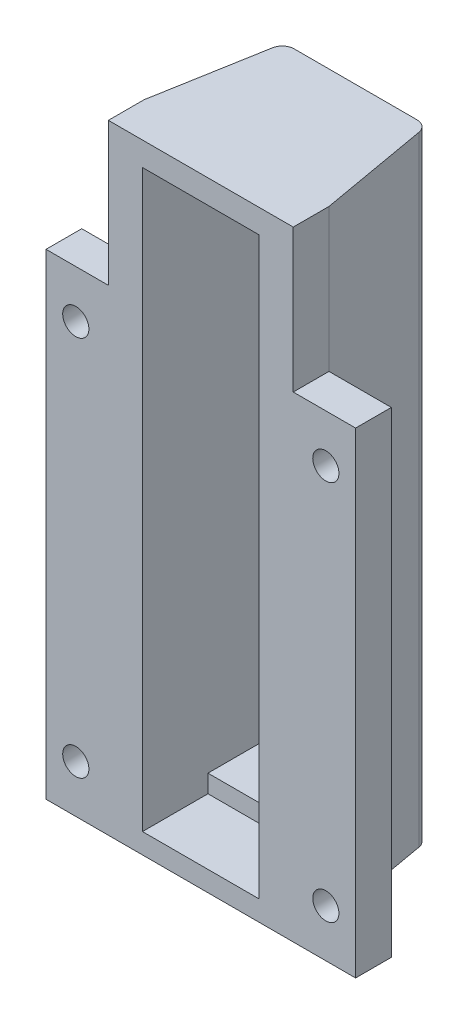
ISO-10303-21;
HEADER;
FILE_DESCRIPTION(('STEP AP214'),'2;1');
FILE_NAME('part.step','',(''),(''),'','','');
FILE_SCHEMA(('AUTOMOTIVE_DESIGN { 1 0 10303 214 1 1 1 1 }'));
ENDSEC;
DATA;
#1=APPLICATION_CONTEXT('core data for automotive mechanical design processes');
#2=APPLICATION_PROTOCOL_DEFINITION('international standard','automotive_design',2000,#1);
#3=PRODUCT_CONTEXT('',#1,'mechanical');
#4=PRODUCT('Part','Part','',(#3));
#5=PRODUCT_RELATED_PRODUCT_CATEGORY('part','',(#4));
#6=PRODUCT_DEFINITION_FORMATION('','',#4);
#7=PRODUCT_DEFINITION_CONTEXT('part definition',#1,'design');
#8=PRODUCT_DEFINITION('design','',#6,#7);
#9=PRODUCT_DEFINITION_SHAPE('','',#8);
#10=(LENGTH_UNIT() NAMED_UNIT(*) SI_UNIT(.MILLI.,.METRE.));
#11=(NAMED_UNIT(*) PLANE_ANGLE_UNIT() SI_UNIT($,.RADIAN.));
#12=(NAMED_UNIT(*) SI_UNIT($,.STERADIAN.) SOLID_ANGLE_UNIT());
#13=UNCERTAINTY_MEASURE_WITH_UNIT(LENGTH_MEASURE(1.E-05),#10,'distance_accuracy_value','');
#14=(GEOMETRIC_REPRESENTATION_CONTEXT(3) GLOBAL_UNCERTAINTY_ASSIGNED_CONTEXT((#13)) GLOBAL_UNIT_ASSIGNED_CONTEXT((#10,
#11,#12)) REPRESENTATION_CONTEXT('',''));
#15=CARTESIAN_POINT('',(0.,0.,0.));
#16=DIRECTION('',(0.,0.,1.));
#17=DIRECTION('',(1.,0.,0.));
#18=AXIS2_PLACEMENT_3D('',#15,#16,#17);
#19=CARTESIAN_POINT('',(0.,5.34999999999999,-11.5));
#20=DIRECTION('',(0.,0.,1.));
#21=DIRECTION('',(1.,0.,0.));
#22=AXIS2_PLACEMENT_3D('',#19,#20,#21);
#23=CYLINDRICAL_SURFACE('',#22,1.1);
#24=CARTESIAN_POINT('',(0.,5.34999999999999,-8.5));
#25=DIRECTION('',(0.,0.,1.));
#26=DIRECTION('',(-1.,0.,0.));
#27=AXIS2_PLACEMENT_3D('',#24,#25,#26);
#28=CIRCLE('',#27,1.1);
#29=CARTESIAN_POINT('',(-1.1,5.34999999999999,-8.5));
#30=VERTEX_POINT('',#29);
#31=EDGE_CURVE('E242',#30,#30,#28,.T.);
#32=ORIENTED_EDGE('',*,*,#31,.T.);
#33=EDGE_LOOP('',(#32));
#34=FACE_BOUND('',#33,.T.);
#35=CARTESIAN_POINT('',(0.,5.34999999999999,-10.3));
#36=DIRECTION('',(0.,0.,-1.));
#37=DIRECTION('',(-1.,0.,0.));
#38=AXIS2_PLACEMENT_3D('',#35,#36,#37);
#39=CIRCLE('',#38,1.1);
#40=CARTESIAN_POINT('',(-1.1,5.34999999999999,-10.3));
#41=VERTEX_POINT('',#40);
#42=EDGE_CURVE('E430',#41,#41,#39,.F.);
#43=ORIENTED_EDGE('',*,*,#42,.F.);
#44=EDGE_LOOP('',(#43));
#45=FACE_BOUND('',#44,.T.);
#46=ADVANCED_FACE('F41',(#34,#45),#23,.F.);
#47=CARTESIAN_POINT('',(0.,46.35,-11.5));
#48=DIRECTION('',(0.,0.,1.));
#49=DIRECTION('',(1.,0.,0.));
#50=AXIS2_PLACEMENT_3D('',#47,#48,#49);
#51=CYLINDRICAL_SURFACE('',#50,1.1);
#52=CARTESIAN_POINT('',(0.,46.35,-8.5));
#53=DIRECTION('',(0.,0.,1.));
#54=DIRECTION('',(1.,0.,0.));
#55=AXIS2_PLACEMENT_3D('',#52,#53,#54);
#56=CIRCLE('',#55,1.1);
#57=CARTESIAN_POINT('',(1.1,46.35,-8.5));
#58=VERTEX_POINT('',#57);
#59=EDGE_CURVE('E249',#58,#58,#56,.T.);
#60=ORIENTED_EDGE('',*,*,#59,.T.);
#61=EDGE_LOOP('',(#60));
#62=FACE_BOUND('',#61,.T.);
#63=CARTESIAN_POINT('',(0.,46.35,-10.3));
#64=DIRECTION('',(0.,0.,-1.));
#65=DIRECTION('',(-1.,0.,0.));
#66=AXIS2_PLACEMENT_3D('',#63,#64,#65);
#67=CIRCLE('',#66,1.1);
#68=CARTESIAN_POINT('',(-1.1,46.35,-10.3));
#69=VERTEX_POINT('',#68);
#70=EDGE_CURVE('E427',#69,#69,#67,.F.);
#71=ORIENTED_EDGE('',*,*,#70,.F.);
#72=EDGE_LOOP('',(#71));
#73=FACE_BOUND('',#72,.T.);
#74=ADVANCED_FACE('F493',(#62,#73),#51,.F.);
#75=CARTESIAN_POINT('',(0.,40.,-8.5));
#76=DIRECTION('',(0.,0.,-1.));
#77=DIRECTION('',(-1.,0.,0.));
#78=AXIS2_PLACEMENT_3D('',#75,#76,#77);
#79=PLANE('',#78);
#80=ORIENTED_EDGE('',*,*,#59,.F.);
#81=EDGE_LOOP('',(#80));
#82=FACE_BOUND('',#81,.T.);
#83=ORIENTED_EDGE('',*,*,#31,.F.);
#84=EDGE_LOOP('',(#83));
#85=FACE_BOUND('',#84,.T.);
#86=DIRECTION('',(0.,1.,0.));
#87=VECTOR('',#86,1.);
#88=CARTESIAN_POINT('',(4.89999999999999,3.2,-8.49999999999999));
#89=LINE('',#88,#87);
#90=CARTESIAN_POINT('',(4.89999999999999,3.2,-8.49999999999999));
#91=VERTEX_POINT('',#90);
#92=CARTESIAN_POINT('',(4.89999999999999,48.5,-8.49999999999999));
#93=VERTEX_POINT('',#92);
#94=EDGE_CURVE('E322',#91,#93,#89,.T.);
#95=ORIENTED_EDGE('',*,*,#94,.T.);
#96=DIRECTION('',(-1.,0.,0.));
#97=VECTOR('',#96,1.);
#98=CARTESIAN_POINT('',(-4.90000000000001,48.5,-8.49999999999999));
#99=LINE('',#98,#97);
#100=CARTESIAN_POINT('',(-4.90000000000001,48.5,-8.49999999999999));
#101=VERTEX_POINT('',#100);
#102=EDGE_CURVE('E317',#93,#101,#99,.T.);
#103=ORIENTED_EDGE('',*,*,#102,.T.);
#104=DIRECTION('',(0.,-1.,0.));
#105=VECTOR('',#104,1.);
#106=CARTESIAN_POINT('',(-4.90000000000001,3.2,-8.49999999999999));
#107=LINE('',#106,#105);
#108=CARTESIAN_POINT('',(-4.90000000000001,3.2,-8.49999999999999));
#109=VERTEX_POINT('',#108);
#110=EDGE_CURVE('E331',#101,#109,#107,.T.);
#111=ORIENTED_EDGE('',*,*,#110,.T.);
#112=DIRECTION('',(1.,0.,0.));
#113=VECTOR('',#112,1.);
#114=CARTESIAN_POINT('',(-4.90000000000001,3.2,-8.49999999999999));
#115=LINE('',#114,#113);
#116=EDGE_CURVE('E327',#109,#91,#115,.T.);
#117=ORIENTED_EDGE('',*,*,#116,.T.);
#118=EDGE_LOOP('',(#95,#103,#111,#117));
#119=FACE_BOUND('',#118,.T.);
#120=DIRECTION('',(0.,1.,0.));
#121=VECTOR('',#120,1.);
#122=CARTESIAN_POINT('',(1.75,8.35,-8.5));
#123=LINE('',#122,#121);
#124=CARTESIAN_POINT('',(1.75,8.35,-8.5));
#125=VERTEX_POINT('',#124);
#126=CARTESIAN_POINT('',(1.75,43.35,-8.5));
#127=VERTEX_POINT('',#126);
#128=EDGE_CURVE('E218',#125,#127,#123,.T.);
#129=ORIENTED_EDGE('',*,*,#128,.F.);
#130=DIRECTION('',(1.,0.,0.));
#131=VECTOR('',#130,1.);
#132=CARTESIAN_POINT('',(-1.75,8.35,-8.5));
#133=LINE('',#132,#131);
#134=CARTESIAN_POINT('',(-1.75,8.35,-8.5));
#135=VERTEX_POINT('',#134);
#136=EDGE_CURVE('E236',#135,#125,#133,.T.);
#137=ORIENTED_EDGE('',*,*,#136,.F.);
#138=DIRECTION('',(0.,-1.,0.));
#139=VECTOR('',#138,1.);
#140=CARTESIAN_POINT('',(-1.75,8.35,-8.5));
#141=LINE('',#140,#139);
#142=CARTESIAN_POINT('',(-1.75,43.35,-8.5));
#143=VERTEX_POINT('',#142);
#144=EDGE_CURVE('E239',#143,#135,#141,.T.);
#145=ORIENTED_EDGE('',*,*,#144,.F.);
#146=DIRECTION('',(-1.,0.,0.));
#147=VECTOR('',#146,1.);
#148=CARTESIAN_POINT('',(-1.75,43.35,-8.5));
#149=LINE('',#148,#147);
#150=EDGE_CURVE('E248',#127,#143,#149,.T.);
#151=ORIENTED_EDGE('',*,*,#150,.F.);
#152=EDGE_LOOP('',(#129,#137,#145,#151));
#153=FACE_BOUND('',#152,.T.);
#154=ADVANCED_FACE('F499',(#82,#85,#119,#153),#79,.F.);
#155=CARTESIAN_POINT('',(0.,40.,0.));
#156=DIRECTION('',(0.,1.,0.));
#157=DIRECTION('',(0.,0.,1.));
#158=AXIS2_PLACEMENT_3D('',#155,#156,#157);
#159=PLANE('',#158);
#160=DIRECTION('',(0.,0.,-1.));
#161=VECTOR('',#160,1.);
#162=CARTESIAN_POINT('',(7.76326980708461,40.,1.5));
#163=LINE('',#162,#161);
#164=CARTESIAN_POINT('',(7.76326980708461,40.,1.5));
#165=VERTEX_POINT('',#164);
#166=CARTESIAN_POINT('',(7.76326980708461,40.,-1.5));
#167=VERTEX_POINT('',#166);
#168=EDGE_CURVE('E346',#165,#167,#163,.T.);
#169=ORIENTED_EDGE('',*,*,#168,.F.);
#170=DIRECTION('',(1.,0.,0.));
#171=VECTOR('',#170,1.);
#172=CARTESIAN_POINT('',(0.,40.,1.5));
#173=LINE('',#172,#171);
#174=CARTESIAN_POINT('',(13.,40.,1.5));
#175=VERTEX_POINT('',#174);
#176=EDGE_CURVE('E380',#165,#175,#173,.T.);
#177=ORIENTED_EDGE('',*,*,#176,.T.);
#178=DIRECTION('',(0.,0.,-1.));
#179=VECTOR('',#178,1.);
#180=CARTESIAN_POINT('',(13.,40.,0.));
#181=LINE('',#180,#179);
#182=CARTESIAN_POINT('',(13.,40.,-1.5));
#183=VERTEX_POINT('',#182);
#184=EDGE_CURVE('E383',#175,#183,#181,.T.);
#185=ORIENTED_EDGE('',*,*,#184,.T.);
#186=DIRECTION('',(1.,0.,0.));
#187=VECTOR('',#186,1.);
#188=CARTESIAN_POINT('',(0.,40.,-1.5));
#189=LINE('',#188,#187);
#190=EDGE_CURVE('E385',#167,#183,#189,.T.);
#191=ORIENTED_EDGE('',*,*,#190,.F.);
#192=EDGE_LOOP('',(#169,#177,#185,#191));
#193=FACE_BOUND('',#192,.T.);
#194=ADVANCED_FACE('F566',(#193),#159,.T.);
#195=CARTESIAN_POINT('',(0.,40.,-11.5));
#196=DIRECTION('',(0.,0.,-1.));
#197=DIRECTION('',(-1.,0.,0.));
#198=AXIS2_PLACEMENT_3D('',#195,#196,#197);
#199=PLANE('',#198);
#200=CARTESIAN_POINT('',(0.,46.35,-11.5));
#201=DIRECTION('',(0.,0.,-1.));
#202=DIRECTION('',(-1.,0.,0.));
#203=AXIS2_PLACEMENT_3D('',#200,#201,#202);
#204=CIRCLE('',#203,1.95);
#205=CARTESIAN_POINT('',(-1.95,46.35,-11.5));
#206=VERTEX_POINT('',#205);
#207=EDGE_CURVE('E610',#206,#206,#204,.T.);
#208=ORIENTED_EDGE('',*,*,#207,.F.);
#209=EDGE_LOOP('',(#208));
#210=FACE_BOUND('',#209,.T.);
#211=CARTESIAN_POINT('',(0.,5.34999999999999,-11.5));
#212=DIRECTION('',(0.,0.,-1.));
#213=DIRECTION('',(-1.,0.,0.));
#214=AXIS2_PLACEMENT_3D('',#211,#212,#213);
#215=CIRCLE('',#214,1.95);
#216=CARTESIAN_POINT('',(-1.95,5.34999999999999,-11.5));
#217=VERTEX_POINT('',#216);
#218=EDGE_CURVE('E613',#217,#217,#215,.T.);
#219=ORIENTED_EDGE('',*,*,#218,.F.);
#220=EDGE_LOOP('',(#219));
#221=FACE_BOUND('',#220,.T.);
#222=DIRECTION('',(0.,1.,0.));
#223=VECTOR('',#222,1.);
#224=CARTESIAN_POINT('',(1.75,8.35,-11.5));
#225=LINE('',#224,#223);
#226=CARTESIAN_POINT('',(1.75,8.35,-11.5));
#227=VERTEX_POINT('',#226);
#228=CARTESIAN_POINT('',(1.75,43.35,-11.5));
#229=VERTEX_POINT('',#228);
#230=EDGE_CURVE('E215',#227,#229,#225,.T.);
#231=ORIENTED_EDGE('',*,*,#230,.T.);
#232=DIRECTION('',(-1.,0.,0.));
#233=VECTOR('',#232,1.);
#234=CARTESIAN_POINT('',(-1.75,43.35,-11.5));
#235=LINE('',#234,#233);
#236=CARTESIAN_POINT('',(-1.75,43.35,-11.5));
#237=VERTEX_POINT('',#236);
#238=EDGE_CURVE('E227',#229,#237,#235,.T.);
#239=ORIENTED_EDGE('',*,*,#238,.T.);
#240=DIRECTION('',(0.,-1.,0.));
#241=VECTOR('',#240,1.);
#242=CARTESIAN_POINT('',(-1.75,8.35,-11.5));
#243=LINE('',#242,#241);
#244=CARTESIAN_POINT('',(-1.75,8.35,-11.5));
#245=VERTEX_POINT('',#244);
#246=EDGE_CURVE('E231',#237,#245,#243,.T.);
#247=ORIENTED_EDGE('',*,*,#246,.T.);
#248=DIRECTION('',(1.,0.,0.));
#249=VECTOR('',#248,1.);
#250=CARTESIAN_POINT('',(-1.75,8.35,-11.5));
#251=LINE('',#250,#249);
#252=EDGE_CURVE('E223',#245,#227,#251,.T.);
#253=ORIENTED_EDGE('',*,*,#252,.T.);
#254=EDGE_LOOP('',(#231,#239,#247,#253));
#255=FACE_BOUND('',#254,.T.);
#256=DIRECTION('',(-1.,0.,0.));
#257=VECTOR('',#256,1.);
#258=CARTESIAN_POINT('',(-6.,52.,-11.5));
#259=LINE('',#258,#257);
#260=CARTESIAN_POINT('',(5.16090036882272,52.,-11.5));
#261=VERTEX_POINT('',#260);
#262=CARTESIAN_POINT('',(-5.16090036882272,52.,-11.5));
#263=VERTEX_POINT('',#262);
#264=EDGE_CURVE('E343',#261,#263,#259,.T.);
#265=ORIENTED_EDGE('',*,*,#264,.F.);
#266=DIRECTION('',(0.,-1.,0.));
#267=VECTOR('',#266,1.);
#268=CARTESIAN_POINT('',(5.16090036882272,40.,-11.5));
#269=LINE('',#268,#267);
#270=CARTESIAN_POINT('',(5.16090036882272,0.,-11.5));
#271=VERTEX_POINT('',#270);
#272=EDGE_CURVE('E435',#261,#271,#269,.T.);
#273=ORIENTED_EDGE('',*,*,#272,.T.);
#274=DIRECTION('',(1.,0.,0.));
#275=VECTOR('',#274,1.);
#276=CARTESIAN_POINT('',(0.,0.,-11.5));
#277=LINE('',#276,#275);
#278=CARTESIAN_POINT('',(-5.16090036882272,0.,-11.5));
#279=VERTEX_POINT('',#278);
#280=EDGE_CURVE('E372',#279,#271,#277,.T.);
#281=ORIENTED_EDGE('',*,*,#280,.F.);
#282=DIRECTION('',(0.,-1.,0.));
#283=VECTOR('',#282,1.);
#284=CARTESIAN_POINT('',(-5.16090036882272,52.,-11.5));
#285=LINE('',#284,#283);
#286=EDGE_CURVE('E422',#279,#263,#285,.F.);
#287=ORIENTED_EDGE('',*,*,#286,.T.);
#288=EDGE_LOOP('',(#265,#273,#281,#287));
#289=FACE_BOUND('',#288,.T.);
#290=ADVANCED_FACE('F233',(#210,#221,#255,#289),#199,.T.);
#291=CARTESIAN_POINT('',(-7.78569368648029,40.,-1.372827860458));
#292=DIRECTION('',(0.984807753012209,0.,0.173648177666927));
#293=DIRECTION('',(0.173648177666927,0.,-0.984807753012209));
#294=AXIS2_PLACEMENT_3D('',#291,#292,#293);
#295=PLANE('',#294);
#296=DIRECTION('',(-0.173648177666927,0.,0.984807753012209));
#297=VECTOR('',#296,1.);
#298=CARTESIAN_POINT('',(-6.,52.,-11.5));
#299=LINE('',#298,#297);
#300=CARTESIAN_POINT('',(-6.14570812183493,52.,-10.6736481776669));
#301=VERTEX_POINT('',#300);
#302=CARTESIAN_POINT('',(-7.76326980708461,52.,-1.5));
#303=VERTEX_POINT('',#302);
#304=EDGE_CURVE('E345',#301,#303,#299,.T.);
#305=ORIENTED_EDGE('',*,*,#304,.F.);
#306=DIRECTION('',(0.,-1.,0.));
#307=VECTOR('',#306,1.);
#308=CARTESIAN_POINT('',(-6.14570812183492,0.,-10.6736481776669));
#309=LINE('',#308,#307);
#310=CARTESIAN_POINT('',(-6.14570812183492,0.,-10.6736481776669));
#311=VERTEX_POINT('',#310);
#312=EDGE_CURVE('E13',#301,#311,#309,.T.);
#313=ORIENTED_EDGE('',*,*,#312,.T.);
#314=DIRECTION('',(-0.173648177666927,0.,0.984807753012209));
#315=VECTOR('',#314,1.);
#316=CARTESIAN_POINT('',(-7.78569368648029,0.,-1.372827860458));
#317=LINE('',#316,#315);
#318=CARTESIAN_POINT('',(-7.76326980708461,0.,-1.5));
#319=VERTEX_POINT('',#318);
#320=EDGE_CURVE('E391',#311,#319,#317,.T.);
#321=ORIENTED_EDGE('',*,*,#320,.T.);
#322=DIRECTION('',(0.,-1.,0.));
#323=VECTOR('',#322,1.);
#324=CARTESIAN_POINT('',(-7.76326980708461,40.,-1.5));
#325=LINE('',#324,#323);
#326=CARTESIAN_POINT('',(-7.76326980708461,40.,-1.5));
#327=VERTEX_POINT('',#326);
#328=EDGE_CURVE('E419',#327,#319,#325,.T.);
#329=ORIENTED_EDGE('',*,*,#328,.F.);
#330=DIRECTION('',(0.,-1.,0.));
#331=VECTOR('',#330,1.);
#332=CARTESIAN_POINT('',(-7.76326980708461,52.,-1.5));
#333=LINE('',#332,#331);
#334=EDGE_CURVE('E369',#303,#327,#333,.T.);
#335=ORIENTED_EDGE('',*,*,#334,.F.);
#336=EDGE_LOOP('',(#305,#313,#321,#329,#335));
#337=FACE_BOUND('',#336,.T.);
#338=ADVANCED_FACE('F483',(#337),#295,.F.);
#339=CARTESIAN_POINT('',(0.,40.,-1.5));
#340=DIRECTION('',(0.,0.,-1.));
#341=DIRECTION('',(-1.,0.,0.));
#342=AXIS2_PLACEMENT_3D('',#339,#340,#341);
#343=PLANE('',#342);
#344=CARTESIAN_POINT('',(-10.5,4.,-1.5));
#345=DIRECTION('',(0.,0.,-1.));
#346=DIRECTION('',(-1.,0.,0.));
#347=AXIS2_PLACEMENT_3D('',#344,#345,#346);
#348=CIRCLE('',#347,1.1);
#349=CARTESIAN_POINT('',(-11.6,4.,-1.5));
#350=VERTEX_POINT('',#349);
#351=EDGE_CURVE('E274',#350,#350,#348,.T.);
#352=ORIENTED_EDGE('',*,*,#351,.F.);
#353=EDGE_LOOP('',(#352));
#354=FACE_BOUND('',#353,.T.);
#355=CARTESIAN_POINT('',(-10.5,36.,-1.5));
#356=DIRECTION('',(0.,0.,-1.));
#357=DIRECTION('',(-1.,0.,0.));
#358=AXIS2_PLACEMENT_3D('',#355,#356,#357);
#359=CIRCLE('',#358,1.1);
#360=CARTESIAN_POINT('',(-11.6,36.,-1.5));
#361=VERTEX_POINT('',#360);
#362=EDGE_CURVE('E271',#361,#361,#359,.T.);
#363=ORIENTED_EDGE('',*,*,#362,.F.);
#364=EDGE_LOOP('',(#363));
#365=FACE_BOUND('',#364,.T.);
#366=DIRECTION('',(1.,0.,0.));
#367=VECTOR('',#366,1.);
#368=CARTESIAN_POINT('',(0.,0.,-1.5));
#369=LINE('',#368,#367);
#370=CARTESIAN_POINT('',(-13.,0.,-1.5));
#371=VERTEX_POINT('',#370);
#372=EDGE_CURVE('E393',#371,#319,#369,.T.);
#373=ORIENTED_EDGE('',*,*,#372,.F.);
#374=DIRECTION('',(0.,-1.,0.));
#375=VECTOR('',#374,1.);
#376=CARTESIAN_POINT('',(-13.,40.,-1.5));
#377=LINE('',#376,#375);
#378=CARTESIAN_POINT('',(-13.,40.,-1.5));
#379=VERTEX_POINT('',#378);
#380=EDGE_CURVE('E417',#379,#371,#377,.T.);
#381=ORIENTED_EDGE('',*,*,#380,.F.);
#382=DIRECTION('',(1.,0.,0.));
#383=VECTOR('',#382,1.);
#384=CARTESIAN_POINT('',(0.,40.,-1.5));
#385=LINE('',#384,#383);
#386=EDGE_CURVE('E373',#379,#327,#385,.T.);
#387=ORIENTED_EDGE('',*,*,#386,.T.);
#388=ORIENTED_EDGE('',*,*,#328,.T.);
#389=EDGE_LOOP('',(#373,#381,#387,#388));
#390=FACE_BOUND('',#389,.T.);
#391=ADVANCED_FACE('F478',(#354,#365,#390),#343,.T.);
#392=CARTESIAN_POINT('',(-13.,40.,0.));
#393=DIRECTION('',(-1.,0.,0.));
#394=DIRECTION('',(0.,0.,1.));
#395=AXIS2_PLACEMENT_3D('',#392,#393,#394);
#396=PLANE('',#395);
#397=DIRECTION('',(0.,0.,-1.));
#398=VECTOR('',#397,1.);
#399=CARTESIAN_POINT('',(-13.,0.,0.));
#400=LINE('',#399,#398);
#401=CARTESIAN_POINT('',(-13.,0.,1.5));
#402=VERTEX_POINT('',#401);
#403=EDGE_CURVE('E396',#402,#371,#400,.T.);
#404=ORIENTED_EDGE('',*,*,#403,.F.);
#405=DIRECTION('',(0.,-1.,0.));
#406=VECTOR('',#405,1.);
#407=CARTESIAN_POINT('',(-13.,40.,1.5));
#408=LINE('',#407,#406);
#409=CARTESIAN_POINT('',(-13.,40.,1.5));
#410=VERTEX_POINT('',#409);
#411=EDGE_CURVE('E415',#410,#402,#408,.T.);
#412=ORIENTED_EDGE('',*,*,#411,.F.);
#413=DIRECTION('',(0.,0.,-1.));
#414=VECTOR('',#413,1.);
#415=CARTESIAN_POINT('',(-13.,40.,0.));
#416=LINE('',#415,#414);
#417=EDGE_CURVE('E376',#410,#379,#416,.T.);
#418=ORIENTED_EDGE('',*,*,#417,.T.);
#419=ORIENTED_EDGE('',*,*,#380,.T.);
#420=EDGE_LOOP('',(#404,#412,#418,#419));
#421=FACE_BOUND('',#420,.T.);
#422=ADVANCED_FACE('F474',(#421),#396,.T.);
#423=CARTESIAN_POINT('',(0.,40.,1.5));
#424=DIRECTION('',(0.,0.,-1.));
#425=DIRECTION('',(-1.,0.,0.));
#426=AXIS2_PLACEMENT_3D('',#423,#424,#425);
#427=PLANE('',#426);
#428=CARTESIAN_POINT('',(10.5,36.,1.5));
#429=DIRECTION('',(0.,0.,1.));
#430=DIRECTION('',(-1.,0.,0.));
#431=AXIS2_PLACEMENT_3D('',#428,#429,#430);
#432=CIRCLE('',#431,1.1);
#433=CARTESIAN_POINT('',(9.4,36.,1.5));
#434=VERTEX_POINT('',#433);
#435=EDGE_CURVE('E254',#434,#434,#432,.T.);
#436=ORIENTED_EDGE('',*,*,#435,.F.);
#437=EDGE_LOOP('',(#436));
#438=FACE_BOUND('',#437,.T.);
#439=CARTESIAN_POINT('',(10.5,4.,1.5));
#440=DIRECTION('',(0.,0.,1.));
#441=DIRECTION('',(1.,0.,0.));
#442=AXIS2_PLACEMENT_3D('',#439,#440,#441);
#443=CIRCLE('',#442,1.1);
#444=CARTESIAN_POINT('',(11.6,4.,1.5));
#445=VERTEX_POINT('',#444);
#446=EDGE_CURVE('E263',#445,#445,#443,.T.);
#447=ORIENTED_EDGE('',*,*,#446,.F.);
#448=EDGE_LOOP('',(#447));
#449=FACE_BOUND('',#448,.T.);
#450=CARTESIAN_POINT('',(-10.5,4.,1.5));
#451=DIRECTION('',(0.,0.,1.));
#452=DIRECTION('',(-1.,0.,0.));
#453=AXIS2_PLACEMENT_3D('',#450,#451,#452);
#454=CIRCLE('',#453,1.1);
#455=CARTESIAN_POINT('',(-11.6,4.,1.5));
#456=VERTEX_POINT('',#455);
#457=EDGE_CURVE('E259',#456,#456,#454,.T.);
#458=ORIENTED_EDGE('',*,*,#457,.F.);
#459=EDGE_LOOP('',(#458));
#460=FACE_BOUND('',#459,.T.);
#461=CARTESIAN_POINT('',(-10.5,36.,1.5));
#462=DIRECTION('',(0.,0.,1.));
#463=DIRECTION('',(1.,0.,0.));
#464=AXIS2_PLACEMENT_3D('',#461,#462,#463);
#465=CIRCLE('',#464,1.1);
#466=CARTESIAN_POINT('',(-9.4,36.,1.5));
#467=VERTEX_POINT('',#466);
#468=EDGE_CURVE('E262',#467,#467,#465,.T.);
#469=ORIENTED_EDGE('',*,*,#468,.F.);
#470=EDGE_LOOP('',(#469));
#471=FACE_BOUND('',#470,.T.);
#472=DIRECTION('',(0.,-1.,0.));
#473=VECTOR('',#472,1.);
#474=CARTESIAN_POINT('',(-4.90000000000001,3.2,1.5));
#475=LINE('',#474,#473);
#476=CARTESIAN_POINT('',(-4.90000000000001,50.,1.5));
#477=VERTEX_POINT('',#476);
#478=CARTESIAN_POINT('',(-4.90000000000001,1.70000000000001,1.5));
#479=VERTEX_POINT('',#478);
#480=EDGE_CURVE('E315',#477,#479,#475,.T.);
#481=ORIENTED_EDGE('',*,*,#480,.F.);
#482=DIRECTION('',(-1.,0.,0.));
#483=VECTOR('',#482,1.);
#484=CARTESIAN_POINT('',(-4.90000000000001,50.,1.5));
#485=LINE('',#484,#483);
#486=CARTESIAN_POINT('',(4.90000000000001,50.,1.5));
#487=VERTEX_POINT('',#486);
#488=EDGE_CURVE('E278',#487,#477,#485,.T.);
#489=ORIENTED_EDGE('',*,*,#488,.F.);
#490=DIRECTION('',(0.,1.,0.));
#491=VECTOR('',#490,1.);
#492=CARTESIAN_POINT('',(4.89999999999999,3.2,1.5));
#493=LINE('',#492,#491);
#494=CARTESIAN_POINT('',(4.90000000000001,1.70000000000001,1.5));
#495=VERTEX_POINT('',#494);
#496=EDGE_CURVE('E314',#495,#487,#493,.T.);
#497=ORIENTED_EDGE('',*,*,#496,.F.);
#498=DIRECTION('',(1.,0.,0.));
#499=VECTOR('',#498,1.);
#500=CARTESIAN_POINT('',(-4.90000000000001,1.70000000000001,1.5));
#501=LINE('',#500,#499);
#502=EDGE_CURVE('E279',#479,#495,#501,.T.);
#503=ORIENTED_EDGE('',*,*,#502,.F.);
#504=EDGE_LOOP('',(#481,#489,#497,#503));
#505=FACE_BOUND('',#504,.T.);
#506=DIRECTION('',(1.,0.,0.));
#507=VECTOR('',#506,1.);
#508=CARTESIAN_POINT('',(0.,0.,1.5));
#509=LINE('',#508,#507);
#510=CARTESIAN_POINT('',(13.,0.,1.5));
#511=VERTEX_POINT('',#510);
#512=EDGE_CURVE('E399',#402,#511,#509,.T.);
#513=ORIENTED_EDGE('',*,*,#512,.T.);
#514=DIRECTION('',(0.,-1.,0.));
#515=VECTOR('',#514,1.);
#516=CARTESIAN_POINT('',(13.,40.,1.5));
#517=LINE('',#516,#515);
#518=EDGE_CURVE('E412',#175,#511,#517,.T.);
#519=ORIENTED_EDGE('',*,*,#518,.F.);
#520=ORIENTED_EDGE('',*,*,#176,.F.);
#521=DIRECTION('',(0.,-1.,0.));
#522=VECTOR('',#521,1.);
#523=CARTESIAN_POINT('',(7.76326980708461,52.,1.5));
#524=LINE('',#523,#522);
#525=CARTESIAN_POINT('',(7.76326980708461,52.,1.5));
#526=VERTEX_POINT('',#525);
#527=EDGE_CURVE('E363',#526,#165,#524,.T.);
#528=ORIENTED_EDGE('',*,*,#527,.F.);
#529=DIRECTION('',(1.,0.,0.));
#530=VECTOR('',#529,1.);
#531=CARTESIAN_POINT('',(-7.76326980708461,52.,1.5));
#532=LINE('',#531,#530);
#533=CARTESIAN_POINT('',(-7.76326980708461,52.,1.5));
#534=VERTEX_POINT('',#533);
#535=EDGE_CURVE('E350',#534,#526,#532,.T.);
#536=ORIENTED_EDGE('',*,*,#535,.F.);
#537=DIRECTION('',(0.,-1.,0.));
#538=VECTOR('',#537,1.);
#539=CARTESIAN_POINT('',(-7.76326980708461,52.,1.5));
#540=LINE('',#539,#538);
#541=CARTESIAN_POINT('',(-7.76326980708461,40.,1.5));
#542=VERTEX_POINT('',#541);
#543=EDGE_CURVE('E366',#534,#542,#540,.T.);
#544=ORIENTED_EDGE('',*,*,#543,.T.);
#545=EDGE_CURVE('E381',#410,#542,#173,.T.);
#546=ORIENTED_EDGE('',*,*,#545,.F.);
#547=ORIENTED_EDGE('',*,*,#411,.T.);
#548=EDGE_LOOP('',(#513,#519,#520,#528,#536,#544,#546,#547));
#549=FACE_BOUND('',#548,.T.);
#550=ADVANCED_FACE('F469',(#438,#449,#460,#471,#505,#549),#427,.F.);
#551=CARTESIAN_POINT('',(13.,40.,0.));
#552=DIRECTION('',(-1.,0.,0.));
#553=DIRECTION('',(0.,0.,1.));
#554=AXIS2_PLACEMENT_3D('',#551,#552,#553);
#555=PLANE('',#554);
#556=DIRECTION('',(0.,0.,-1.));
#557=VECTOR('',#556,1.);
#558=CARTESIAN_POINT('',(13.,0.,0.));
#559=LINE('',#558,#557);
#560=CARTESIAN_POINT('',(13.,0.,-1.5));
#561=VERTEX_POINT('',#560);
#562=EDGE_CURVE('E401',#511,#561,#559,.T.);
#563=ORIENTED_EDGE('',*,*,#562,.T.);
#564=DIRECTION('',(0.,-1.,0.));
#565=VECTOR('',#564,1.);
#566=CARTESIAN_POINT('',(13.,40.,-1.5));
#567=LINE('',#566,#565);
#568=EDGE_CURVE('E410',#183,#561,#567,.T.);
#569=ORIENTED_EDGE('',*,*,#568,.F.);
#570=ORIENTED_EDGE('',*,*,#184,.F.);
#571=ORIENTED_EDGE('',*,*,#518,.T.);
#572=EDGE_LOOP('',(#563,#569,#570,#571));
#573=FACE_BOUND('',#572,.T.);
#574=ADVANCED_FACE('F464',(#573),#555,.F.);
#575=CARTESIAN_POINT('',(0.,40.,-1.5));
#576=DIRECTION('',(0.,0.,-1.));
#577=DIRECTION('',(-1.,0.,0.));
#578=AXIS2_PLACEMENT_3D('',#575,#576,#577);
#579=PLANE('',#578);
#580=CARTESIAN_POINT('',(10.5,36.,-1.5));
#581=DIRECTION('',(0.,0.,-1.));
#582=DIRECTION('',(-1.,0.,0.));
#583=AXIS2_PLACEMENT_3D('',#580,#581,#582);
#584=CIRCLE('',#583,1.1);
#585=CARTESIAN_POINT('',(9.4,36.,-1.5));
#586=VERTEX_POINT('',#585);
#587=EDGE_CURVE('E275',#586,#586,#584,.T.);
#588=ORIENTED_EDGE('',*,*,#587,.F.);
#589=EDGE_LOOP('',(#588));
#590=FACE_BOUND('',#589,.T.);
#591=CARTESIAN_POINT('',(10.5,4.,-1.5));
#592=DIRECTION('',(0.,0.,-1.));
#593=DIRECTION('',(-1.,0.,0.));
#594=AXIS2_PLACEMENT_3D('',#591,#592,#593);
#595=CIRCLE('',#594,1.1);
#596=CARTESIAN_POINT('',(9.4,4.,-1.5));
#597=VERTEX_POINT('',#596);
#598=EDGE_CURVE('E270',#597,#597,#595,.T.);
#599=ORIENTED_EDGE('',*,*,#598,.F.);
#600=EDGE_LOOP('',(#599));
#601=FACE_BOUND('',#600,.T.);
#602=DIRECTION('',(1.,0.,0.));
#603=VECTOR('',#602,1.);
#604=CARTESIAN_POINT('',(0.,0.,-1.5));
#605=LINE('',#604,#603);
#606=CARTESIAN_POINT('',(7.76326980708461,0.,-1.5));
#607=VERTEX_POINT('',#606);
#608=EDGE_CURVE('E404',#607,#561,#605,.T.);
#609=ORIENTED_EDGE('',*,*,#608,.F.);
#610=DIRECTION('',(0.,-1.,0.));
#611=VECTOR('',#610,1.);
#612=CARTESIAN_POINT('',(7.76326980708461,40.,-1.5));
#613=LINE('',#612,#611);
#614=EDGE_CURVE('E388',#167,#607,#613,.T.);
#615=ORIENTED_EDGE('',*,*,#614,.F.);
#616=ORIENTED_EDGE('',*,*,#190,.T.);
#617=ORIENTED_EDGE('',*,*,#568,.T.);
#618=EDGE_LOOP('',(#609,#615,#616,#617));
#619=FACE_BOUND('',#618,.T.);
#620=ADVANCED_FACE('F458',(#590,#601,#619),#579,.T.);
#621=CARTESIAN_POINT('',(7.78569368648029,40.,-1.372827860458));
#622=DIRECTION('',(0.984807753012209,0.,-0.173648177666927));
#623=DIRECTION('',(-0.173648177666927,0.,-0.984807753012209));
#624=AXIS2_PLACEMENT_3D('',#621,#622,#623);
#625=PLANE('',#624);
#626=DIRECTION('',(0.173648177666927,0.,0.984807753012209));
#627=VECTOR('',#626,1.);
#628=CARTESIAN_POINT('',(7.78569368648029,0.,-1.372827860458));
#629=LINE('',#628,#627);
#630=CARTESIAN_POINT('',(6.14570812183492,0.,-10.6736481776669));
#631=VERTEX_POINT('',#630);
#632=EDGE_CURVE('E377',#631,#607,#629,.T.);
#633=ORIENTED_EDGE('',*,*,#632,.F.);
#634=DIRECTION('',(0.,-1.,0.));
#635=VECTOR('',#634,1.);
#636=CARTESIAN_POINT('',(6.14570812183492,40.,-10.6736481776669));
#637=LINE('',#636,#635);
#638=CARTESIAN_POINT('',(6.14570812183493,52.,-10.6736481776669));
#639=VERTEX_POINT('',#638);
#640=EDGE_CURVE('E64',#631,#639,#637,.F.);
#641=ORIENTED_EDGE('',*,*,#640,.T.);
#642=DIRECTION('',(-0.173648177666927,0.,-0.984807753012209));
#643=VECTOR('',#642,1.);
#644=CARTESIAN_POINT('',(6.,52.,-11.5));
#645=LINE('',#644,#643);
#646=CARTESIAN_POINT('',(7.76326980708461,52.,-1.5));
#647=VERTEX_POINT('',#646);
#648=EDGE_CURVE('E354',#647,#639,#645,.T.);
#649=ORIENTED_EDGE('',*,*,#648,.F.);
#650=DIRECTION('',(0.,-1.,0.));
#651=VECTOR('',#650,1.);
#652=CARTESIAN_POINT('',(7.76326980708461,52.,-1.5));
#653=LINE('',#652,#651);
#654=EDGE_CURVE('E356',#647,#167,#653,.T.);
#655=ORIENTED_EDGE('',*,*,#654,.T.);
#656=ORIENTED_EDGE('',*,*,#614,.T.);
#657=EDGE_LOOP('',(#633,#641,#649,#655,#656));
#658=FACE_BOUND('',#657,.T.);
#659=ADVANCED_FACE('F453',(#658),#625,.T.);
#660=DIRECTION('',(0.,0.,1.));
#661=VECTOR('',#660,1.);
#662=CARTESIAN_POINT('',(-7.76326980708461,40.,-1.5));
#663=LINE('',#662,#661);
#664=EDGE_CURVE('E342',#327,#542,#663,.T.);
#665=ORIENTED_EDGE('',*,*,#664,.F.);
#666=ORIENTED_EDGE('',*,*,#386,.F.);
#667=ORIENTED_EDGE('',*,*,#417,.F.);
#668=ORIENTED_EDGE('',*,*,#545,.T.);
#669=EDGE_LOOP('',(#665,#666,#667,#668));
#670=FACE_BOUND('',#669,.T.);
#671=ADVANCED_FACE('F578',(#670),#159,.T.);
#672=CARTESIAN_POINT('',(0.,0.,0.));
#673=DIRECTION('',(0.,1.,0.));
#674=DIRECTION('',(0.,0.,1.));
#675=AXIS2_PLACEMENT_3D('',#672,#673,#674);
#676=PLANE('',#675);
#677=ORIENTED_EDGE('',*,*,#280,.T.);
#678=CARTESIAN_POINT('',(5.16090036882272,0.,-10.5));
#679=DIRECTION('',(0.,1.,0.));
#680=DIRECTION('',(0.,0.,1.));
#681=AXIS2_PLACEMENT_3D('',#678,#679,#680);
#682=CIRCLE('',#681,1.);
#683=EDGE_CURVE('E440',#271,#631,#682,.F.);
#684=ORIENTED_EDGE('',*,*,#683,.T.);
#685=ORIENTED_EDGE('',*,*,#632,.T.);
#686=ORIENTED_EDGE('',*,*,#608,.T.);
#687=ORIENTED_EDGE('',*,*,#562,.F.);
#688=ORIENTED_EDGE('',*,*,#512,.F.);
#689=ORIENTED_EDGE('',*,*,#403,.T.);
#690=ORIENTED_EDGE('',*,*,#372,.T.);
#691=ORIENTED_EDGE('',*,*,#320,.F.);
#692=CARTESIAN_POINT('',(-5.16090036882272,0.,-10.5));
#693=DIRECTION('',(0.,1.,0.));
#694=DIRECTION('',(0.,0.,1.));
#695=AXIS2_PLACEMENT_3D('',#692,#693,#694);
#696=CIRCLE('',#695,1.);
#697=EDGE_CURVE('E438',#311,#279,#696,.F.);
#698=ORIENTED_EDGE('',*,*,#697,.T.);
#699=EDGE_LOOP('',(#677,#684,#685,#686,#687,#688,#689,#690,#691,#698));
#700=FACE_BOUND('',#699,.T.);
#701=ADVANCED_FACE('F452',(#700),#676,.F.);
#702=CARTESIAN_POINT('',(-7.76326980708461,52.,-1.5));
#703=DIRECTION('',(1.,0.,0.));
#704=DIRECTION('',(0.,0.,-1.));
#705=AXIS2_PLACEMENT_3D('',#702,#703,#704);
#706=PLANE('',#705);
#707=ORIENTED_EDGE('',*,*,#664,.T.);
#708=ORIENTED_EDGE('',*,*,#543,.F.);
#709=DIRECTION('',(0.,0.,1.));
#710=VECTOR('',#709,1.);
#711=CARTESIAN_POINT('',(-7.76326980708461,52.,-1.5));
#712=LINE('',#711,#710);
#713=EDGE_CURVE('E348',#303,#534,#712,.T.);
#714=ORIENTED_EDGE('',*,*,#713,.F.);
#715=ORIENTED_EDGE('',*,*,#334,.T.);
#716=EDGE_LOOP('',(#707,#708,#714,#715));
#717=FACE_BOUND('',#716,.T.);
#718=ADVANCED_FACE('F573',(#717),#706,.F.);
#719=CARTESIAN_POINT('',(7.76326980708461,52.,1.5));
#720=DIRECTION('',(-1.,0.,0.));
#721=DIRECTION('',(0.,0.,1.));
#722=AXIS2_PLACEMENT_3D('',#719,#720,#721);
#723=PLANE('',#722);
#724=ORIENTED_EDGE('',*,*,#168,.T.);
#725=ORIENTED_EDGE('',*,*,#654,.F.);
#726=DIRECTION('',(0.,0.,-1.));
#727=VECTOR('',#726,1.);
#728=CARTESIAN_POINT('',(7.76326980708461,52.,1.5));
#729=LINE('',#728,#727);
#730=EDGE_CURVE('E352',#526,#647,#729,.T.);
#731=ORIENTED_EDGE('',*,*,#730,.F.);
#732=ORIENTED_EDGE('',*,*,#527,.T.);
#733=EDGE_LOOP('',(#724,#725,#731,#732));
#734=FACE_BOUND('',#733,.T.);
#735=ADVANCED_FACE('F570',(#734),#723,.F.);
#736=CARTESIAN_POINT('',(0.,52.,0.));
#737=DIRECTION('',(0.,1.,0.));
#738=DIRECTION('',(0.,0.,1.));
#739=AXIS2_PLACEMENT_3D('',#736,#737,#738);
#740=PLANE('',#739);
#741=ORIENTED_EDGE('',*,*,#648,.T.);
#742=CARTESIAN_POINT('',(5.16090036882272,52.,-10.5));
#743=DIRECTION('',(0.,1.,0.));
#744=DIRECTION('',(0.,0.,1.));
#745=AXIS2_PLACEMENT_3D('',#742,#743,#744);
#746=CIRCLE('',#745,1.);
#747=EDGE_CURVE('E49',#639,#261,#746,.T.);
#748=ORIENTED_EDGE('',*,*,#747,.T.);
#749=ORIENTED_EDGE('',*,*,#264,.T.);
#750=CARTESIAN_POINT('',(-5.16090036882272,52.,-10.5));
#751=DIRECTION('',(0.,1.,0.));
#752=DIRECTION('',(0.,0.,1.));
#753=AXIS2_PLACEMENT_3D('',#750,#751,#752);
#754=CIRCLE('',#753,1.);
#755=EDGE_CURVE('E56',#263,#301,#754,.T.);
#756=ORIENTED_EDGE('',*,*,#755,.T.);
#757=ORIENTED_EDGE('',*,*,#304,.T.);
#758=ORIENTED_EDGE('',*,*,#713,.T.);
#759=ORIENTED_EDGE('',*,*,#535,.T.);
#760=ORIENTED_EDGE('',*,*,#730,.T.);
#761=EDGE_LOOP('',(#741,#748,#749,#756,#757,#758,#759,#760));
#762=FACE_BOUND('',#761,.T.);
#763=ADVANCED_FACE('F445',(#762),#740,.T.);
#764=CARTESIAN_POINT('',(-4.90000000000001,48.5,-57.8479233623255));
#765=DIRECTION('',(0.,1.,0.));
#766=DIRECTION('',(0.,0.,1.));
#767=AXIS2_PLACEMENT_3D('',#764,#765,#766);
#768=PLANE('',#767);
#769=DIRECTION('',(0.,0.,1.));
#770=VECTOR('',#769,1.);
#771=CARTESIAN_POINT('',(4.89999999999999,48.5,-57.8479233623255));
#772=LINE('',#771,#770);
#773=CARTESIAN_POINT('',(4.89999999999999,48.5,-4.));
#774=VERTEX_POINT('',#773);
#775=EDGE_CURVE('E325',#93,#774,#772,.T.);
#776=ORIENTED_EDGE('',*,*,#775,.T.);
#777=DIRECTION('',(-1.,0.,0.));
#778=VECTOR('',#777,1.);
#779=CARTESIAN_POINT('',(-4.90000000000001,48.5,-4.));
#780=LINE('',#779,#778);
#781=CARTESIAN_POINT('',(-4.90000000000001,48.5,-4.));
#782=VERTEX_POINT('',#781);
#783=EDGE_CURVE('E311',#774,#782,#780,.T.);
#784=ORIENTED_EDGE('',*,*,#783,.T.);
#785=DIRECTION('',(0.,0.,1.));
#786=VECTOR('',#785,1.);
#787=CARTESIAN_POINT('',(-4.90000000000001,48.5,-57.8479233623255));
#788=LINE('',#787,#786);
#789=EDGE_CURVE('E321',#101,#782,#788,.T.);
#790=ORIENTED_EDGE('',*,*,#789,.F.);
#791=ORIENTED_EDGE('',*,*,#102,.F.);
#792=EDGE_LOOP('',(#776,#784,#790,#791));
#793=FACE_BOUND('',#792,.T.);
#794=ADVANCED_FACE('F559',(#793),#768,.F.);
#795=CARTESIAN_POINT('',(-4.90000000000001,3.2,-57.8479233623255));
#796=DIRECTION('',(-1.,0.,0.));
#797=DIRECTION('',(0.,0.,1.));
#798=AXIS2_PLACEMENT_3D('',#795,#796,#797);
#799=PLANE('',#798);
#800=ORIENTED_EDGE('',*,*,#789,.T.);
#801=DIRECTION('',(0.,-1.,0.));
#802=VECTOR('',#801,1.);
#803=CARTESIAN_POINT('',(-4.90000000000001,1.70000000000001,-4.));
#804=LINE('',#803,#802);
#805=CARTESIAN_POINT('',(-4.90000000000001,50.,-4.));
#806=VERTEX_POINT('',#805);
#807=EDGE_CURVE('E297',#806,#782,#804,.T.);
#808=ORIENTED_EDGE('',*,*,#807,.F.);
#809=DIRECTION('',(0.,0.,1.));
#810=VECTOR('',#809,1.);
#811=CARTESIAN_POINT('',(-4.90000000000001,50.,-57.7841759594294));
#812=LINE('',#811,#810);
#813=EDGE_CURVE('E287',#806,#477,#812,.T.);
#814=ORIENTED_EDGE('',*,*,#813,.T.);
#815=ORIENTED_EDGE('',*,*,#480,.T.);
#816=DIRECTION('',(0.,0.,1.));
#817=VECTOR('',#816,1.);
#818=CARTESIAN_POINT('',(-4.90000000000001,1.70000000000001,-57.7841759594294));
#819=LINE('',#818,#817);
#820=CARTESIAN_POINT('',(-4.90000000000001,1.70000000000001,-4.));
#821=VERTEX_POINT('',#820);
#822=EDGE_CURVE('E296',#821,#479,#819,.T.);
#823=ORIENTED_EDGE('',*,*,#822,.F.);
#824=CARTESIAN_POINT('',(-4.90000000000001,3.2,-4.));
#825=VERTEX_POINT('',#824);
#826=EDGE_CURVE('E299',#825,#821,#804,.T.);
#827=ORIENTED_EDGE('',*,*,#826,.F.);
#828=DIRECTION('',(0.,0.,1.));
#829=VECTOR('',#828,1.);
#830=CARTESIAN_POINT('',(-4.90000000000001,3.2,-57.8479233623255));
#831=LINE('',#830,#829);
#832=EDGE_CURVE('E330',#109,#825,#831,.T.);
#833=ORIENTED_EDGE('',*,*,#832,.F.);
#834=ORIENTED_EDGE('',*,*,#110,.F.);
#835=EDGE_LOOP('',(#800,#808,#814,#815,#823,#827,#833,#834));
#836=FACE_BOUND('',#835,.T.);
#837=ADVANCED_FACE('F555',(#836),#799,.F.);
#838=CARTESIAN_POINT('',(-4.90000000000001,3.2,-57.8479233623255));
#839=DIRECTION('',(0.,-1.,0.));
#840=DIRECTION('',(0.,0.,-1.));
#841=AXIS2_PLACEMENT_3D('',#838,#839,#840);
#842=PLANE('',#841);
#843=ORIENTED_EDGE('',*,*,#832,.T.);
#844=DIRECTION('',(1.,0.,0.));
#845=VECTOR('',#844,1.);
#846=CARTESIAN_POINT('',(-4.90000000000001,3.2,-4.));
#847=LINE('',#846,#845);
#848=CARTESIAN_POINT('',(4.90000000000001,3.2,-4.));
#849=VERTEX_POINT('',#848);
#850=EDGE_CURVE('E308',#825,#849,#847,.T.);
#851=ORIENTED_EDGE('',*,*,#850,.T.);
#852=DIRECTION('',(0.,0.,1.));
#853=VECTOR('',#852,1.);
#854=CARTESIAN_POINT('',(4.89999999999999,3.2,-57.8479233623255));
#855=LINE('',#854,#853);
#856=EDGE_CURVE('E326',#91,#849,#855,.T.);
#857=ORIENTED_EDGE('',*,*,#856,.F.);
#858=ORIENTED_EDGE('',*,*,#116,.F.);
#859=EDGE_LOOP('',(#843,#851,#857,#858));
#860=FACE_BOUND('',#859,.T.);
#861=ADVANCED_FACE('F551',(#860),#842,.F.);
#862=CARTESIAN_POINT('',(4.89999999999999,3.2,-57.8479233623255));
#863=DIRECTION('',(1.,0.,0.));
#864=DIRECTION('',(0.,0.,-1.));
#865=AXIS2_PLACEMENT_3D('',#862,#863,#864);
#866=PLANE('',#865);
#867=ORIENTED_EDGE('',*,*,#856,.T.);
#868=DIRECTION('',(0.,1.,0.));
#869=VECTOR('',#868,1.);
#870=CARTESIAN_POINT('',(4.90000000000001,1.70000000000001,-4.));
#871=LINE('',#870,#869);
#872=CARTESIAN_POINT('',(4.90000000000001,1.70000000000001,-4.));
#873=VERTEX_POINT('',#872);
#874=EDGE_CURVE('E288',#873,#849,#871,.T.);
#875=ORIENTED_EDGE('',*,*,#874,.F.);
#876=DIRECTION('',(0.,0.,1.));
#877=VECTOR('',#876,1.);
#878=CARTESIAN_POINT('',(4.90000000000001,1.70000000000001,-57.7841759594294));
#879=LINE('',#878,#877);
#880=EDGE_CURVE('E295',#873,#495,#879,.T.);
#881=ORIENTED_EDGE('',*,*,#880,.T.);
#882=ORIENTED_EDGE('',*,*,#496,.T.);
#883=DIRECTION('',(0.,0.,1.));
#884=VECTOR('',#883,1.);
#885=CARTESIAN_POINT('',(4.90000000000001,50.,-57.7841759594294));
#886=LINE('',#885,#884);
#887=CARTESIAN_POINT('',(4.90000000000001,50.,-4.));
#888=VERTEX_POINT('',#887);
#889=EDGE_CURVE('E290',#888,#487,#886,.T.);
#890=ORIENTED_EDGE('',*,*,#889,.F.);
#891=EDGE_CURVE('E291',#774,#888,#871,.T.);
#892=ORIENTED_EDGE('',*,*,#891,.F.);
#893=ORIENTED_EDGE('',*,*,#775,.F.);
#894=ORIENTED_EDGE('',*,*,#94,.F.);
#895=EDGE_LOOP('',(#867,#875,#881,#882,#890,#892,#893,#894));
#896=FACE_BOUND('',#895,.T.);
#897=ADVANCED_FACE('F548',(#896),#866,.F.);
#898=CARTESIAN_POINT('',(0.,40.,-4.));
#899=DIRECTION('',(0.,0.,-1.));
#900=DIRECTION('',(-1.,0.,0.));
#901=AXIS2_PLACEMENT_3D('',#898,#899,#900);
#902=PLANE('',#901);
#903=ORIENTED_EDGE('',*,*,#826,.T.);
#904=DIRECTION('',(1.,0.,0.));
#905=VECTOR('',#904,1.);
#906=CARTESIAN_POINT('',(-4.90000000000001,1.70000000000001,-4.));
#907=LINE('',#906,#905);
#908=EDGE_CURVE('E292',#821,#873,#907,.T.);
#909=ORIENTED_EDGE('',*,*,#908,.T.);
#910=ORIENTED_EDGE('',*,*,#874,.T.);
#911=ORIENTED_EDGE('',*,*,#850,.F.);
#912=EDGE_LOOP('',(#903,#909,#910,#911));
#913=FACE_BOUND('',#912,.T.);
#914=ADVANCED_FACE('F540',(#913),#902,.F.);
#915=CARTESIAN_POINT('',(-4.90000000000001,1.70000000000001,-57.7841759594294));
#916=DIRECTION('',(0.,-1.,0.));
#917=DIRECTION('',(0.,0.,-1.));
#918=AXIS2_PLACEMENT_3D('',#915,#916,#917);
#919=PLANE('',#918);
#920=ORIENTED_EDGE('',*,*,#822,.T.);
#921=ORIENTED_EDGE('',*,*,#502,.T.);
#922=ORIENTED_EDGE('',*,*,#880,.F.);
#923=ORIENTED_EDGE('',*,*,#908,.F.);
#924=EDGE_LOOP('',(#920,#921,#922,#923));
#925=FACE_BOUND('',#924,.T.);
#926=ADVANCED_FACE('F536',(#925),#919,.F.);
#927=ORIENTED_EDGE('',*,*,#891,.T.);
#928=DIRECTION('',(-1.,0.,0.));
#929=VECTOR('',#928,1.);
#930=CARTESIAN_POINT('',(-4.90000000000001,50.,-4.));
#931=LINE('',#930,#929);
#932=EDGE_CURVE('E282',#888,#806,#931,.T.);
#933=ORIENTED_EDGE('',*,*,#932,.T.);
#934=ORIENTED_EDGE('',*,*,#807,.T.);
#935=ORIENTED_EDGE('',*,*,#783,.F.);
#936=EDGE_LOOP('',(#927,#933,#934,#935));
#937=FACE_BOUND('',#936,.T.);
#938=ADVANCED_FACE('F539',(#937),#902,.F.);
#939=CARTESIAN_POINT('',(-4.90000000000001,50.,-57.7841759594294));
#940=DIRECTION('',(0.,1.,0.));
#941=DIRECTION('',(0.,0.,1.));
#942=AXIS2_PLACEMENT_3D('',#939,#940,#941);
#943=PLANE('',#942);
#944=ORIENTED_EDGE('',*,*,#889,.T.);
#945=ORIENTED_EDGE('',*,*,#488,.T.);
#946=ORIENTED_EDGE('',*,*,#813,.F.);
#947=ORIENTED_EDGE('',*,*,#932,.F.);
#948=EDGE_LOOP('',(#944,#945,#946,#947));
#949=FACE_BOUND('',#948,.T.);
#950=ADVANCED_FACE('F528',(#949),#943,.F.);
#951=CARTESIAN_POINT('',(10.5,4.,-11.5));
#952=DIRECTION('',(0.,0.,1.));
#953=DIRECTION('',(1.,0.,0.));
#954=AXIS2_PLACEMENT_3D('',#951,#952,#953);
#955=CYLINDRICAL_SURFACE('',#954,1.1);
#956=ORIENTED_EDGE('',*,*,#598,.T.);
#957=EDGE_LOOP('',(#956));
#958=FACE_BOUND('',#957,.T.);
#959=ORIENTED_EDGE('',*,*,#446,.T.);
#960=EDGE_LOOP('',(#959));
#961=FACE_BOUND('',#960,.T.);
#962=ADVANCED_FACE('F524',(#958,#961),#955,.F.);
#963=CARTESIAN_POINT('',(10.5,36.,-11.5));
#964=DIRECTION('',(0.,0.,1.));
#965=DIRECTION('',(1.,0.,0.));
#966=AXIS2_PLACEMENT_3D('',#963,#964,#965);
#967=CYLINDRICAL_SURFACE('',#966,1.1);
#968=ORIENTED_EDGE('',*,*,#587,.T.);
#969=EDGE_LOOP('',(#968));
#970=FACE_BOUND('',#969,.T.);
#971=ORIENTED_EDGE('',*,*,#435,.T.);
#972=EDGE_LOOP('',(#971));
#973=FACE_BOUND('',#972,.T.);
#974=ADVANCED_FACE('F527',(#970,#973),#967,.F.);
#975=CARTESIAN_POINT('',(-10.5,36.,-11.5));
#976=DIRECTION('',(0.,0.,1.));
#977=DIRECTION('',(1.,0.,0.));
#978=AXIS2_PLACEMENT_3D('',#975,#976,#977);
#979=CYLINDRICAL_SURFACE('',#978,1.1);
#980=ORIENTED_EDGE('',*,*,#362,.T.);
#981=EDGE_LOOP('',(#980));
#982=FACE_BOUND('',#981,.T.);
#983=ORIENTED_EDGE('',*,*,#468,.T.);
#984=EDGE_LOOP('',(#983));
#985=FACE_BOUND('',#984,.T.);
#986=ADVANCED_FACE('F522',(#982,#985),#979,.F.);
#987=CARTESIAN_POINT('',(-10.5,4.,-11.5));
#988=DIRECTION('',(0.,0.,1.));
#989=DIRECTION('',(1.,0.,0.));
#990=AXIS2_PLACEMENT_3D('',#987,#988,#989);
#991=CYLINDRICAL_SURFACE('',#990,1.1);
#992=ORIENTED_EDGE('',*,*,#351,.T.);
#993=EDGE_LOOP('',(#992));
#994=FACE_BOUND('',#993,.T.);
#995=ORIENTED_EDGE('',*,*,#457,.T.);
#996=EDGE_LOOP('',(#995));
#997=FACE_BOUND('',#996,.T.);
#998=ADVANCED_FACE('F519',(#994,#997),#991,.F.);
#999=CARTESIAN_POINT('',(1.75,8.35,-11.5));
#1000=DIRECTION('',(1.,0.,0.));
#1001=DIRECTION('',(0.,0.,-1.));
#1002=AXIS2_PLACEMENT_3D('',#999,#1000,#1001);
#1003=PLANE('',#1002);
#1004=ORIENTED_EDGE('',*,*,#128,.T.);
#1005=DIRECTION('',(0.,0.,1.));
#1006=VECTOR('',#1005,1.);
#1007=CARTESIAN_POINT('',(1.75,43.35,-11.5));
#1008=LINE('',#1007,#1006);
#1009=EDGE_CURVE('E211',#229,#127,#1008,.T.);
#1010=ORIENTED_EDGE('',*,*,#1009,.F.);
#1011=ORIENTED_EDGE('',*,*,#230,.F.);
#1012=DIRECTION('',(0.,0.,1.));
#1013=VECTOR('',#1012,1.);
#1014=CARTESIAN_POINT('',(1.75,8.35,-11.5));
#1015=LINE('',#1014,#1013);
#1016=EDGE_CURVE('E252',#227,#125,#1015,.T.);
#1017=ORIENTED_EDGE('',*,*,#1016,.T.);
#1018=EDGE_LOOP('',(#1004,#1010,#1011,#1017));
#1019=FACE_BOUND('',#1018,.T.);
#1020=ADVANCED_FACE('F213',(#1019),#1003,.F.);
#1021=CARTESIAN_POINT('',(-1.75,8.35,-11.5));
#1022=DIRECTION('',(0.,-1.,0.));
#1023=DIRECTION('',(0.,0.,-1.));
#1024=AXIS2_PLACEMENT_3D('',#1021,#1022,#1023);
#1025=PLANE('',#1024);
#1026=ORIENTED_EDGE('',*,*,#136,.T.);
#1027=ORIENTED_EDGE('',*,*,#1016,.F.);
#1028=ORIENTED_EDGE('',*,*,#252,.F.);
#1029=DIRECTION('',(0.,0.,1.));
#1030=VECTOR('',#1029,1.);
#1031=CARTESIAN_POINT('',(-1.75,8.35,-11.5));
#1032=LINE('',#1031,#1030);
#1033=EDGE_CURVE('E255',#245,#135,#1032,.T.);
#1034=ORIENTED_EDGE('',*,*,#1033,.T.);
#1035=EDGE_LOOP('',(#1026,#1027,#1028,#1034));
#1036=FACE_BOUND('',#1035,.T.);
#1037=ADVANCED_FACE('F506',(#1036),#1025,.F.);
#1038=CARTESIAN_POINT('',(-1.75,8.35,-11.5));
#1039=DIRECTION('',(-1.,0.,0.));
#1040=DIRECTION('',(0.,0.,1.));
#1041=AXIS2_PLACEMENT_3D('',#1038,#1039,#1040);
#1042=PLANE('',#1041);
#1043=ORIENTED_EDGE('',*,*,#144,.T.);
#1044=ORIENTED_EDGE('',*,*,#1033,.F.);
#1045=ORIENTED_EDGE('',*,*,#246,.F.);
#1046=DIRECTION('',(0.,0.,1.));
#1047=VECTOR('',#1046,1.);
#1048=CARTESIAN_POINT('',(-1.75,43.35,-11.5));
#1049=LINE('',#1048,#1047);
#1050=EDGE_CURVE('E222',#237,#143,#1049,.T.);
#1051=ORIENTED_EDGE('',*,*,#1050,.T.);
#1052=EDGE_LOOP('',(#1043,#1044,#1045,#1051));
#1053=FACE_BOUND('',#1052,.T.);
#1054=ADVANCED_FACE('F509',(#1053),#1042,.F.);
#1055=CARTESIAN_POINT('',(-1.75,43.35,-11.5));
#1056=DIRECTION('',(0.,1.,0.));
#1057=DIRECTION('',(0.,0.,1.));
#1058=AXIS2_PLACEMENT_3D('',#1055,#1056,#1057);
#1059=PLANE('',#1058);
#1060=ORIENTED_EDGE('',*,*,#150,.T.);
#1061=ORIENTED_EDGE('',*,*,#1050,.F.);
#1062=ORIENTED_EDGE('',*,*,#238,.F.);
#1063=ORIENTED_EDGE('',*,*,#1009,.T.);
#1064=EDGE_LOOP('',(#1060,#1061,#1062,#1063));
#1065=FACE_BOUND('',#1064,.T.);
#1066=ADVANCED_FACE('F228',(#1065),#1059,.F.);
#1067=CARTESIAN_POINT('',(0.,46.35,-10.3));
#1068=DIRECTION('',(0.,0.,-1.));
#1069=DIRECTION('',(-1.,0.,0.));
#1070=AXIS2_PLACEMENT_3D('',#1067,#1068,#1069);
#1071=PLANE('',#1070);
#1072=CARTESIAN_POINT('',(0.,46.35,-10.3));
#1073=DIRECTION('',(0.,0.,-1.));
#1074=DIRECTION('',(-1.,0.,0.));
#1075=AXIS2_PLACEMENT_3D('',#1072,#1073,#1074);
#1076=CIRCLE('',#1075,1.95);
#1077=CARTESIAN_POINT('',(-1.95,46.35,-10.3));
#1078=VERTEX_POINT('',#1077);
#1079=EDGE_CURVE('E431',#1078,#1078,#1076,.T.);
#1080=ORIENTED_EDGE('',*,*,#1079,.T.);
#1081=EDGE_LOOP('',(#1080));
#1082=FACE_BOUND('',#1081,.T.);
#1083=ORIENTED_EDGE('',*,*,#70,.T.);
#1084=EDGE_LOOP('',(#1083));
#1085=FACE_BOUND('',#1084,.T.);
#1086=ADVANCED_FACE('F516',(#1082,#1085),#1071,.T.);
#1087=CARTESIAN_POINT('',(0.,46.35,-10.3));
#1088=DIRECTION('',(0.,0.,-1.));
#1089=DIRECTION('',(-1.,0.,0.));
#1090=AXIS2_PLACEMENT_3D('',#1087,#1088,#1089);
#1091=CYLINDRICAL_SURFACE('',#1090,1.95);
#1092=ORIENTED_EDGE('',*,*,#1079,.F.);
#1093=EDGE_LOOP('',(#1092));
#1094=FACE_BOUND('',#1093,.T.);
#1095=ORIENTED_EDGE('',*,*,#207,.T.);
#1096=EDGE_LOOP('',(#1095));
#1097=FACE_BOUND('',#1096,.T.);
#1098=ADVANCED_FACE('F699',(#1094,#1097),#1091,.F.);
#1099=CARTESIAN_POINT('',(0.,5.34999999999999,-10.3));
#1100=DIRECTION('',(0.,0.,-1.));
#1101=DIRECTION('',(-1.,0.,0.));
#1102=AXIS2_PLACEMENT_3D('',#1099,#1100,#1101);
#1103=PLANE('',#1102);
#1104=CARTESIAN_POINT('',(0.,5.34999999999999,-10.3));
#1105=DIRECTION('',(0.,0.,-1.));
#1106=DIRECTION('',(-1.,0.,0.));
#1107=AXIS2_PLACEMENT_3D('',#1104,#1105,#1106);
#1108=CIRCLE('',#1107,1.95);
#1109=CARTESIAN_POINT('',(-1.95,5.34999999999999,-10.3));
#1110=VERTEX_POINT('',#1109);
#1111=EDGE_CURVE('E615',#1110,#1110,#1108,.T.);
#1112=ORIENTED_EDGE('',*,*,#1111,.T.);
#1113=EDGE_LOOP('',(#1112));
#1114=FACE_BOUND('',#1113,.T.);
#1115=ORIENTED_EDGE('',*,*,#42,.T.);
#1116=EDGE_LOOP('',(#1115));
#1117=FACE_BOUND('',#1116,.T.);
#1118=ADVANCED_FACE('F708',(#1114,#1117),#1103,.T.);
#1119=CARTESIAN_POINT('',(0.,5.34999999999999,-10.3));
#1120=DIRECTION('',(0.,0.,-1.));
#1121=DIRECTION('',(-1.,0.,0.));
#1122=AXIS2_PLACEMENT_3D('',#1119,#1120,#1121);
#1123=CYLINDRICAL_SURFACE('',#1122,1.95);
#1124=ORIENTED_EDGE('',*,*,#1111,.F.);
#1125=EDGE_LOOP('',(#1124));
#1126=FACE_BOUND('',#1125,.T.);
#1127=ORIENTED_EDGE('',*,*,#218,.T.);
#1128=EDGE_LOOP('',(#1127));
#1129=FACE_BOUND('',#1128,.T.);
#1130=ADVANCED_FACE('F491',(#1126,#1129),#1123,.F.);
#1131=CARTESIAN_POINT('',(5.16090036882272,40.,-10.5));
#1132=DIRECTION('',(0.,-1.,0.));
#1133=DIRECTION('',(0.,0.,-1.));
#1134=AXIS2_PLACEMENT_3D('',#1131,#1132,#1133);
#1135=CYLINDRICAL_SURFACE('',#1134,1.);
#1136=ORIENTED_EDGE('',*,*,#747,.F.);
#1137=ORIENTED_EDGE('',*,*,#640,.F.);
#1138=ORIENTED_EDGE('',*,*,#683,.F.);
#1139=ORIENTED_EDGE('',*,*,#272,.F.);
#1140=EDGE_LOOP('',(#1136,#1137,#1138,#1139));
#1141=FACE_BOUND('',#1140,.T.);
#1142=ADVANCED_FACE('F450',(#1141),#1135,.T.);
#1143=CARTESIAN_POINT('',(-5.16090036882272,40.,-10.5));
#1144=DIRECTION('',(0.,1.,0.));
#1145=DIRECTION('',(0.,0.,1.));
#1146=AXIS2_PLACEMENT_3D('',#1143,#1144,#1145);
#1147=CYLINDRICAL_SURFACE('',#1146,1.);
#1148=ORIENTED_EDGE('',*,*,#755,.F.);
#1149=ORIENTED_EDGE('',*,*,#286,.F.);
#1150=ORIENTED_EDGE('',*,*,#697,.F.);
#1151=ORIENTED_EDGE('',*,*,#312,.F.);
#1152=EDGE_LOOP('',(#1148,#1149,#1150,#1151));
#1153=FACE_BOUND('',#1152,.T.);
#1154=ADVANCED_FACE('F43',(#1153),#1147,.T.);
#1155=CLOSED_SHELL('',(#46,#74,#154,#194,#290,#338,#391,#422,#550,#574,#620,#659,#671,#701,#718,
#735,#763,#794,#837,#861,#897,#914,#926,#938,#950,#962,#974,#986,#998,#1020,#1037,#1054,#1066,
#1086,#1098,#1118,#1130,#1142,#1154));
#1156=MANIFOLD_SOLID_BREP('B2',#1155);
#1157=ADVANCED_BREP_SHAPE_REPRESENTATION('',(#18,#1156),#14);
#1158=SHAPE_DEFINITION_REPRESENTATION(#9,#1157);
ENDSEC;
END-ISO-10303-21;
